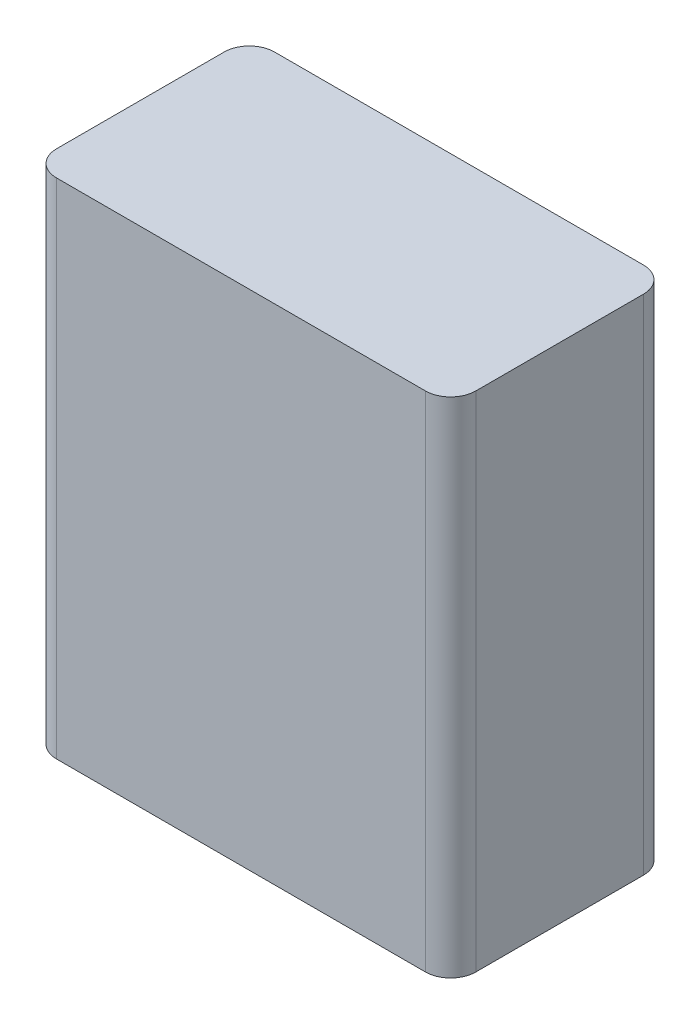
ISO-10303-21;
HEADER;
FILE_DESCRIPTION(('STEP AP214'),'2;1');
FILE_NAME('part.step','',(''),(''),'','','');
FILE_SCHEMA(('AUTOMOTIVE_DESIGN { 1 0 10303 214 1 1 1 1 }'));
ENDSEC;
DATA;
#1=APPLICATION_CONTEXT('core data for automotive mechanical design processes');
#2=APPLICATION_PROTOCOL_DEFINITION('international standard','automotive_design',2000,#1);
#3=PRODUCT_CONTEXT('',#1,'mechanical');
#4=PRODUCT('Part','Part','',(#3));
#5=PRODUCT_RELATED_PRODUCT_CATEGORY('part','',(#4));
#6=PRODUCT_DEFINITION_FORMATION('','',#4);
#7=PRODUCT_DEFINITION_CONTEXT('part definition',#1,'design');
#8=PRODUCT_DEFINITION('design','',#6,#7);
#9=PRODUCT_DEFINITION_SHAPE('','',#8);
#10=(LENGTH_UNIT() NAMED_UNIT(*) SI_UNIT(.MILLI.,.METRE.));
#11=(NAMED_UNIT(*) PLANE_ANGLE_UNIT() SI_UNIT($,.RADIAN.));
#12=(NAMED_UNIT(*) SI_UNIT($,.STERADIAN.) SOLID_ANGLE_UNIT());
#13=UNCERTAINTY_MEASURE_WITH_UNIT(LENGTH_MEASURE(1.E-05),#10,'distance_accuracy_value','');
#14=(GEOMETRIC_REPRESENTATION_CONTEXT(3) GLOBAL_UNCERTAINTY_ASSIGNED_CONTEXT((#13)) GLOBAL_UNIT_ASSIGNED_CONTEXT((#10,
#11,#12)) REPRESENTATION_CONTEXT('',''));
#15=CARTESIAN_POINT('',(0.,0.,0.));
#16=DIRECTION('',(0.,0.,1.));
#17=DIRECTION('',(1.,0.,0.));
#18=AXIS2_PLACEMENT_3D('',#15,#16,#17);
#19=CARTESIAN_POINT('',(0.,30.,0.));
#20=DIRECTION('',(0.,1.,0.));
#21=DIRECTION('',(1.,0.,0.));
#22=AXIS2_PLACEMENT_3D('',#19,#20,#21);
#23=PLANE('',#22);
#24=DIRECTION('',(0.,0.,-1.));
#25=VECTOR('',#24,1.);
#26=CARTESIAN_POINT('',(25.,30.,10.));
#27=LINE('',#26,#25);
#28=CARTESIAN_POINT('',(25.,30.,10.));
#29=VERTEX_POINT('',#28);
#30=CARTESIAN_POINT('',(25.,30.,-10.));
#31=VERTEX_POINT('',#30);
#32=EDGE_CURVE('E11',#29,#31,#27,.T.);
#33=ORIENTED_EDGE('',*,*,#32,.T.);
#34=CARTESIAN_POINT('',(22.,30.,-10.));
#35=DIRECTION('',(0.,1.,0.));
#36=DIRECTION('',(1.,0.,0.));
#37=AXIS2_PLACEMENT_3D('',#34,#35,#36);
#38=CIRCLE('',#37,3.);
#39=CARTESIAN_POINT('',(22.,30.,-13.));
#40=VERTEX_POINT('',#39);
#41=EDGE_CURVE('E151',#31,#40,#38,.T.);
#42=ORIENTED_EDGE('',*,*,#41,.T.);
#43=DIRECTION('',(-1.,0.,0.));
#44=VECTOR('',#43,1.);
#45=CARTESIAN_POINT('',(22.,30.,-13.));
#46=LINE('',#45,#44);
#47=CARTESIAN_POINT('',(-22.,30.,-13.));
#48=VERTEX_POINT('',#47);
#49=EDGE_CURVE('E152',#40,#48,#46,.T.);
#50=ORIENTED_EDGE('',*,*,#49,.T.);
#51=CARTESIAN_POINT('',(-22.,30.,-10.));
#52=DIRECTION('',(0.,1.,0.));
#53=DIRECTION('',(0.,0.,-1.));
#54=AXIS2_PLACEMENT_3D('',#51,#52,#53);
#55=CIRCLE('',#54,3.);
#56=CARTESIAN_POINT('',(-25.,30.,-10.));
#57=VERTEX_POINT('',#56);
#58=EDGE_CURVE('E54',#48,#57,#55,.T.);
#59=ORIENTED_EDGE('',*,*,#58,.T.);
#60=DIRECTION('',(0.,0.,1.));
#61=VECTOR('',#60,1.);
#62=CARTESIAN_POINT('',(-25.,30.,-10.));
#63=LINE('',#62,#61);
#64=CARTESIAN_POINT('',(-25.,30.,10.));
#65=VERTEX_POINT('',#64);
#66=EDGE_CURVE('E64',#57,#65,#63,.T.);
#67=ORIENTED_EDGE('',*,*,#66,.T.);
#68=CARTESIAN_POINT('',(-22.,30.,10.));
#69=DIRECTION('',(0.,1.,0.));
#70=DIRECTION('',(-1.,0.,0.));
#71=AXIS2_PLACEMENT_3D('',#68,#69,#70);
#72=CIRCLE('',#71,3.);
#73=CARTESIAN_POINT('',(-22.,30.,13.));
#74=VERTEX_POINT('',#73);
#75=EDGE_CURVE('E147',#65,#74,#72,.T.);
#76=ORIENTED_EDGE('',*,*,#75,.T.);
#77=DIRECTION('',(1.,0.,0.));
#78=VECTOR('',#77,1.);
#79=CARTESIAN_POINT('',(-22.,30.,13.));
#80=LINE('',#79,#78);
#81=CARTESIAN_POINT('',(22.,30.,13.));
#82=VERTEX_POINT('',#81);
#83=EDGE_CURVE('E115',#74,#82,#80,.T.);
#84=ORIENTED_EDGE('',*,*,#83,.T.);
#85=CARTESIAN_POINT('',(22.,30.,10.));
#86=DIRECTION('',(0.,1.,0.));
#87=DIRECTION('',(0.,0.,1.));
#88=AXIS2_PLACEMENT_3D('',#85,#86,#87);
#89=CIRCLE('',#88,3.);
#90=EDGE_CURVE('E123',#82,#29,#89,.T.);
#91=ORIENTED_EDGE('',*,*,#90,.T.);
#92=EDGE_LOOP('',(#33,#42,#50,#59,#67,#76,#84,#91));
#93=FACE_BOUND('',#92,.T.);
#94=ADVANCED_FACE('F16',(#93),#23,.T.);
#95=CARTESIAN_POINT('',(25.,-30.,13.));
#96=DIRECTION('',(1.,0.,0.));
#97=DIRECTION('',(0.,1.,0.));
#98=AXIS2_PLACEMENT_3D('',#95,#96,#97);
#99=PLANE('',#98);
#100=DIRECTION('',(0.,0.,-1.));
#101=VECTOR('',#100,1.);
#102=CARTESIAN_POINT('',(25.,-30.,10.));
#103=LINE('',#102,#101);
#104=CARTESIAN_POINT('',(25.,-30.,10.));
#105=VERTEX_POINT('',#104);
#106=CARTESIAN_POINT('',(25.,-30.,-10.));
#107=VERTEX_POINT('',#106);
#108=EDGE_CURVE('E135',#105,#107,#103,.T.);
#109=ORIENTED_EDGE('',*,*,#108,.T.);
#110=DIRECTION('',(0.,-1.,0.));
#111=VECTOR('',#110,1.);
#112=CARTESIAN_POINT('',(25.,30.,-10.));
#113=LINE('',#112,#111);
#114=EDGE_CURVE('E27',#31,#107,#113,.T.);
#115=ORIENTED_EDGE('',*,*,#114,.F.);
#116=ORIENTED_EDGE('',*,*,#32,.F.);
#117=DIRECTION('',(0.,-1.,0.));
#118=VECTOR('',#117,1.);
#119=CARTESIAN_POINT('',(25.,30.,10.));
#120=LINE('',#119,#118);
#121=EDGE_CURVE('E121',#29,#105,#120,.T.);
#122=ORIENTED_EDGE('',*,*,#121,.T.);
#123=EDGE_LOOP('',(#109,#115,#116,#122));
#124=FACE_BOUND('',#123,.T.);
#125=ADVANCED_FACE('F119',(#124),#99,.T.);
#126=CARTESIAN_POINT('',(22.,108.216,-10.));
#127=DIRECTION('',(0.,-1.,0.));
#128=DIRECTION('',(0.,0.,-1.));
#129=AXIS2_PLACEMENT_3D('',#126,#127,#128);
#130=CYLINDRICAL_SURFACE('',#129,3.);
#131=DIRECTION('',(0.,-1.,0.));
#132=VECTOR('',#131,1.);
#133=CARTESIAN_POINT('',(22.,30.,-13.));
#134=LINE('',#133,#132);
#135=CARTESIAN_POINT('',(22.,-30.,-13.));
#136=VERTEX_POINT('',#135);
#137=EDGE_CURVE('E148',#40,#136,#134,.T.);
#138=ORIENTED_EDGE('',*,*,#137,.F.);
#139=ORIENTED_EDGE('',*,*,#41,.F.);
#140=ORIENTED_EDGE('',*,*,#114,.T.);
#141=CARTESIAN_POINT('',(22.,-30.,-10.));
#142=DIRECTION('',(0.,-1.,0.));
#143=DIRECTION('',(0.,0.,-1.));
#144=AXIS2_PLACEMENT_3D('',#141,#142,#143);
#145=CIRCLE('',#144,3.);
#146=EDGE_CURVE('E174',#136,#107,#145,.T.);
#147=ORIENTED_EDGE('',*,*,#146,.F.);
#148=EDGE_LOOP('',(#138,#139,#140,#147));
#149=FACE_BOUND('',#148,.T.);
#150=ADVANCED_FACE('F204',(#149),#130,.T.);
#151=CARTESIAN_POINT('',(25.,-30.,-13.));
#152=DIRECTION('',(0.,0.,-1.));
#153=DIRECTION('',(0.,-1.,0.));
#154=AXIS2_PLACEMENT_3D('',#151,#152,#153);
#155=PLANE('',#154);
#156=DIRECTION('',(-1.,0.,0.));
#157=VECTOR('',#156,1.);
#158=CARTESIAN_POINT('',(22.,-30.,-13.));
#159=LINE('',#158,#157);
#160=CARTESIAN_POINT('',(-22.,-30.,-13.));
#161=VERTEX_POINT('',#160);
#162=EDGE_CURVE('E143',#136,#161,#159,.T.);
#163=ORIENTED_EDGE('',*,*,#162,.T.);
#164=DIRECTION('',(0.,-1.,0.));
#165=VECTOR('',#164,1.);
#166=CARTESIAN_POINT('',(-22.,30.,-13.));
#167=LINE('',#166,#165);
#168=EDGE_CURVE('E155',#48,#161,#167,.T.);
#169=ORIENTED_EDGE('',*,*,#168,.F.);
#170=ORIENTED_EDGE('',*,*,#49,.F.);
#171=ORIENTED_EDGE('',*,*,#137,.T.);
#172=EDGE_LOOP('',(#163,#169,#170,#171));
#173=FACE_BOUND('',#172,.T.);
#174=ADVANCED_FACE('F207',(#173),#155,.T.);
#175=CARTESIAN_POINT('',(-22.,108.216,-10.));
#176=DIRECTION('',(0.,-1.,0.));
#177=DIRECTION('',(-1.,0.,0.));
#178=AXIS2_PLACEMENT_3D('',#175,#176,#177);
#179=CYLINDRICAL_SURFACE('',#178,3.);
#180=DIRECTION('',(0.,-1.,0.));
#181=VECTOR('',#180,1.);
#182=CARTESIAN_POINT('',(-25.,30.,-10.));
#183=LINE('',#182,#181);
#184=CARTESIAN_POINT('',(-25.,-30.,-10.));
#185=VERTEX_POINT('',#184);
#186=EDGE_CURVE('E189',#57,#185,#183,.T.);
#187=ORIENTED_EDGE('',*,*,#186,.F.);
#188=ORIENTED_EDGE('',*,*,#58,.F.);
#189=ORIENTED_EDGE('',*,*,#168,.T.);
#190=CARTESIAN_POINT('',(-22.,-30.,-10.));
#191=DIRECTION('',(0.,-1.,0.));
#192=DIRECTION('',(-1.,0.,0.));
#193=AXIS2_PLACEMENT_3D('',#190,#191,#192);
#194=CIRCLE('',#193,3.);
#195=EDGE_CURVE('E140',#185,#161,#194,.T.);
#196=ORIENTED_EDGE('',*,*,#195,.F.);
#197=EDGE_LOOP('',(#187,#188,#189,#196));
#198=FACE_BOUND('',#197,.T.);
#199=ADVANCED_FACE('F18',(#198),#179,.T.);
#200=CARTESIAN_POINT('',(-25.,-30.,-13.));
#201=DIRECTION('',(-1.,0.,0.));
#202=DIRECTION('',(0.,0.,1.));
#203=AXIS2_PLACEMENT_3D('',#200,#201,#202);
#204=PLANE('',#203);
#205=DIRECTION('',(0.,0.,1.));
#206=VECTOR('',#205,1.);
#207=CARTESIAN_POINT('',(-25.,-30.,-10.));
#208=LINE('',#207,#206);
#209=CARTESIAN_POINT('',(-25.,-30.,10.));
#210=VERTEX_POINT('',#209);
#211=EDGE_CURVE('E144',#185,#210,#208,.T.);
#212=ORIENTED_EDGE('',*,*,#211,.T.);
#213=DIRECTION('',(0.,-1.,0.));
#214=VECTOR('',#213,1.);
#215=CARTESIAN_POINT('',(-25.,30.,10.));
#216=LINE('',#215,#214);
#217=EDGE_CURVE('E20',#65,#210,#216,.T.);
#218=ORIENTED_EDGE('',*,*,#217,.F.);
#219=ORIENTED_EDGE('',*,*,#66,.F.);
#220=ORIENTED_EDGE('',*,*,#186,.T.);
#221=EDGE_LOOP('',(#212,#218,#219,#220));
#222=FACE_BOUND('',#221,.T.);
#223=ADVANCED_FACE('F210',(#222),#204,.T.);
#224=CARTESIAN_POINT('',(-22.,108.216,10.));
#225=DIRECTION('',(0.,-1.,0.));
#226=DIRECTION('',(0.,0.,1.));
#227=AXIS2_PLACEMENT_3D('',#224,#225,#226);
#228=CYLINDRICAL_SURFACE('',#227,3.);
#229=DIRECTION('',(0.,-1.,0.));
#230=VECTOR('',#229,1.);
#231=CARTESIAN_POINT('',(-22.,30.,13.));
#232=LINE('',#231,#230);
#233=CARTESIAN_POINT('',(-22.,-30.,13.));
#234=VERTEX_POINT('',#233);
#235=EDGE_CURVE('E96',#74,#234,#232,.T.);
#236=ORIENTED_EDGE('',*,*,#235,.F.);
#237=ORIENTED_EDGE('',*,*,#75,.F.);
#238=ORIENTED_EDGE('',*,*,#217,.T.);
#239=CARTESIAN_POINT('',(-22.,-30.,10.));
#240=DIRECTION('',(0.,-1.,0.));
#241=DIRECTION('',(0.,0.,1.));
#242=AXIS2_PLACEMENT_3D('',#239,#240,#241);
#243=CIRCLE('',#242,3.);
#244=EDGE_CURVE('E160',#234,#210,#243,.T.);
#245=ORIENTED_EDGE('',*,*,#244,.F.);
#246=EDGE_LOOP('',(#236,#237,#238,#245));
#247=FACE_BOUND('',#246,.T.);
#248=ADVANCED_FACE('F217',(#247),#228,.T.);
#249=CARTESIAN_POINT('',(-25.,-30.,13.));
#250=DIRECTION('',(0.,0.,1.));
#251=DIRECTION('',(1.,0.,0.));
#252=AXIS2_PLACEMENT_3D('',#249,#250,#251);
#253=PLANE('',#252);
#254=ORIENTED_EDGE('',*,*,#83,.F.);
#255=ORIENTED_EDGE('',*,*,#235,.T.);
#256=DIRECTION('',(1.,0.,0.));
#257=VECTOR('',#256,1.);
#258=CARTESIAN_POINT('',(-22.,-30.,13.));
#259=LINE('',#258,#257);
#260=CARTESIAN_POINT('',(22.,-30.,13.));
#261=VERTEX_POINT('',#260);
#262=EDGE_CURVE('E163',#234,#261,#259,.T.);
#263=ORIENTED_EDGE('',*,*,#262,.T.);
#264=DIRECTION('',(0.,-1.,0.));
#265=VECTOR('',#264,1.);
#266=CARTESIAN_POINT('',(22.,30.,13.));
#267=LINE('',#266,#265);
#268=EDGE_CURVE('E80',#82,#261,#267,.T.);
#269=ORIENTED_EDGE('',*,*,#268,.F.);
#270=EDGE_LOOP('',(#254,#255,#263,#269));
#271=FACE_BOUND('',#270,.T.);
#272=ADVANCED_FACE('F218',(#271),#253,.T.);
#273=CARTESIAN_POINT('',(22.,108.216,10.));
#274=DIRECTION('',(0.,-1.,0.));
#275=DIRECTION('',(1.,0.,0.));
#276=AXIS2_PLACEMENT_3D('',#273,#274,#275);
#277=CYLINDRICAL_SURFACE('',#276,3.);
#278=ORIENTED_EDGE('',*,*,#121,.F.);
#279=ORIENTED_EDGE('',*,*,#90,.F.);
#280=ORIENTED_EDGE('',*,*,#268,.T.);
#281=CARTESIAN_POINT('',(22.,-30.,10.));
#282=DIRECTION('',(0.,-1.,0.));
#283=DIRECTION('',(1.,0.,0.));
#284=AXIS2_PLACEMENT_3D('',#281,#282,#283);
#285=CIRCLE('',#284,3.);
#286=EDGE_CURVE('E127',#105,#261,#285,.T.);
#287=ORIENTED_EDGE('',*,*,#286,.F.);
#288=EDGE_LOOP('',(#278,#279,#280,#287));
#289=FACE_BOUND('',#288,.T.);
#290=ADVANCED_FACE('F126',(#289),#277,.T.);
#291=CARTESIAN_POINT('',(0.,-30.,0.));
#292=DIRECTION('',(0.,1.,0.));
#293=DIRECTION('',(1.,0.,0.));
#294=AXIS2_PLACEMENT_3D('',#291,#292,#293);
#295=PLANE('',#294);
#296=ORIENTED_EDGE('',*,*,#262,.F.);
#297=ORIENTED_EDGE('',*,*,#244,.T.);
#298=ORIENTED_EDGE('',*,*,#211,.F.);
#299=ORIENTED_EDGE('',*,*,#195,.T.);
#300=ORIENTED_EDGE('',*,*,#162,.F.);
#301=ORIENTED_EDGE('',*,*,#146,.T.);
#302=ORIENTED_EDGE('',*,*,#108,.F.);
#303=ORIENTED_EDGE('',*,*,#286,.T.);
#304=EDGE_LOOP('',(#296,#297,#298,#299,#300,#301,#302,#303));
#305=FACE_BOUND('',#304,.T.);
#306=ADVANCED_FACE('F201',(#305),#295,.F.);
#307=CLOSED_SHELL('',(#94,#125,#150,#174,#199,#223,#248,#272,#290,#306));
#308=MANIFOLD_SOLID_BREP('B1',#307);
#309=ADVANCED_BREP_SHAPE_REPRESENTATION('',(#18,#308),#14);
#310=SHAPE_DEFINITION_REPRESENTATION(#9,#309);
ENDSEC;
END-ISO-10303-21;
